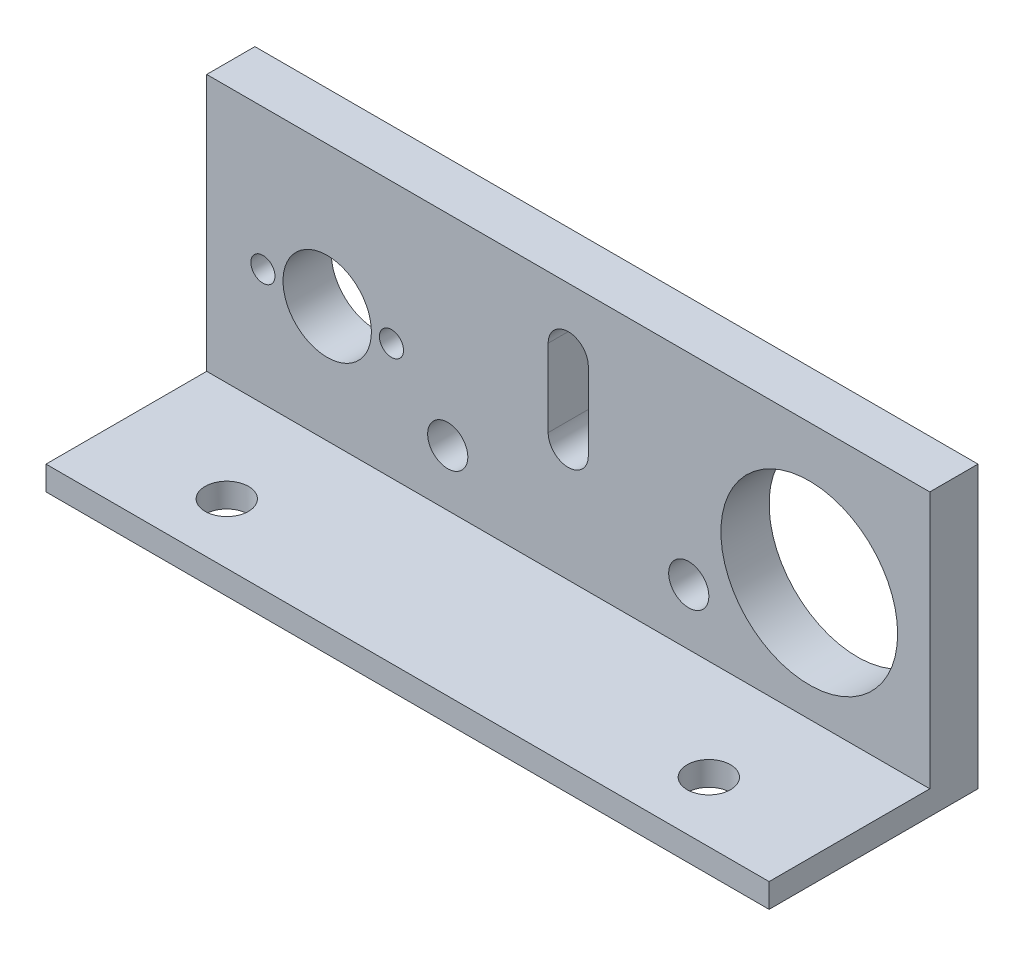
ISO-10303-21;
HEADER;
FILE_DESCRIPTION(('STEP AP214'),'2;1');
FILE_NAME('part.step','',(''),(''),'','','');
FILE_SCHEMA(('AUTOMOTIVE_DESIGN { 1 0 10303 214 1 1 1 1 }'));
ENDSEC;
DATA;
#1=APPLICATION_CONTEXT('core data for automotive mechanical design processes');
#2=APPLICATION_PROTOCOL_DEFINITION('international standard','automotive_design',2000,#1);
#3=PRODUCT_CONTEXT('',#1,'mechanical');
#4=PRODUCT('Part','Part','',(#3));
#5=PRODUCT_RELATED_PRODUCT_CATEGORY('part','',(#4));
#6=PRODUCT_DEFINITION_FORMATION('','',#4);
#7=PRODUCT_DEFINITION_CONTEXT('part definition',#1,'design');
#8=PRODUCT_DEFINITION('design','',#6,#7);
#9=PRODUCT_DEFINITION_SHAPE('','',#8);
#10=(LENGTH_UNIT() NAMED_UNIT(*) SI_UNIT(.MILLI.,.METRE.));
#11=(NAMED_UNIT(*) PLANE_ANGLE_UNIT() SI_UNIT($,.RADIAN.));
#12=(NAMED_UNIT(*) SI_UNIT($,.STERADIAN.) SOLID_ANGLE_UNIT());
#13=UNCERTAINTY_MEASURE_WITH_UNIT(LENGTH_MEASURE(1.E-05),#10,'distance_accuracy_value','');
#14=(GEOMETRIC_REPRESENTATION_CONTEXT(3) GLOBAL_UNCERTAINTY_ASSIGNED_CONTEXT((#13)) GLOBAL_UNIT_ASSIGNED_CONTEXT((#10,
#11,#12)) REPRESENTATION_CONTEXT('',''));
#15=CARTESIAN_POINT('',(0.,0.,0.));
#16=DIRECTION('',(0.,0.,1.));
#17=DIRECTION('',(1.,0.,0.));
#18=AXIS2_PLACEMENT_3D('',#15,#16,#17);
#19=CARTESIAN_POINT('',(0.,0.,6.));
#20=DIRECTION('',(0.,0.,-1.));
#21=DIRECTION('',(-1.,0.,0.));
#22=AXIS2_PLACEMENT_3D('',#19,#20,#21);
#23=PLANE('',#22);
#24=CARTESIAN_POINT('',(15.,-7.49999999999999,6.));
#25=DIRECTION('',(0.,0.,1.));
#26=DIRECTION('',(1.,0.,0.));
#27=AXIS2_PLACEMENT_3D('',#24,#25,#26);
#28=CIRCLE('',#27,2.49999999999999);
#29=CARTESIAN_POINT('',(17.5,-7.49999999999999,6.));
#30=VERTEX_POINT('',#29);
#31=EDGE_CURVE('E217',#30,#30,#28,.T.);
#32=ORIENTED_EDGE('',*,*,#31,.F.);
#33=EDGE_LOOP('',(#32));
#34=FACE_BOUND('',#33,.T.);
#35=CARTESIAN_POINT('',(-15.,-7.49999999999999,6.));
#36=DIRECTION('',(0.,0.,1.));
#37=DIRECTION('',(-1.,0.,0.));
#38=AXIS2_PLACEMENT_3D('',#35,#36,#37);
#39=CIRCLE('',#38,2.5);
#40=CARTESIAN_POINT('',(-17.5,-7.49999999999999,6.));
#41=VERTEX_POINT('',#40);
#42=EDGE_CURVE('E139',#41,#41,#39,.T.);
#43=ORIENTED_EDGE('',*,*,#42,.F.);
#44=EDGE_LOOP('',(#43));
#45=FACE_BOUND('',#44,.T.);
#46=DIRECTION('',(0.,-1.,0.));
#47=VECTOR('',#46,1.);
#48=CARTESIAN_POINT('',(-2.5,9.77898960764086,6.));
#49=LINE('',#48,#47);
#50=CARTESIAN_POINT('',(-2.5,9.77898960764086,6.));
#51=VERTEX_POINT('',#50);
#52=CARTESIAN_POINT('',(-2.49999999999999,0.141519694399124,6.));
#53=VERTEX_POINT('',#52);
#54=EDGE_CURVE('E126',#51,#53,#49,.T.);
#55=ORIENTED_EDGE('',*,*,#54,.F.);
#56=CARTESIAN_POINT('',(0.,9.77898960764086,6.));
#57=DIRECTION('',(0.,0.,1.));
#58=DIRECTION('',(1.,0.,0.));
#59=AXIS2_PLACEMENT_3D('',#56,#57,#58);
#60=CIRCLE('',#59,2.5);
#61=CARTESIAN_POINT('',(2.5,9.77898960764086,6.));
#62=VERTEX_POINT('',#61);
#63=EDGE_CURVE('E53',#62,#51,#60,.T.);
#64=ORIENTED_EDGE('',*,*,#63,.F.);
#65=DIRECTION('',(0.,1.,0.));
#66=VECTOR('',#65,1.);
#67=CARTESIAN_POINT('',(2.5,9.77898960764086,6.));
#68=LINE('',#67,#66);
#69=CARTESIAN_POINT('',(2.5,0.141519694399124,6.));
#70=VERTEX_POINT('',#69);
#71=EDGE_CURVE('E132',#70,#62,#68,.T.);
#72=ORIENTED_EDGE('',*,*,#71,.F.);
#73=CARTESIAN_POINT('',(0.,0.141519694399123,6.));
#74=DIRECTION('',(0.,0.,1.));
#75=DIRECTION('',(1.,0.,0.));
#76=AXIS2_PLACEMENT_3D('',#73,#74,#75);
#77=CIRCLE('',#76,2.5);
#78=EDGE_CURVE('E117',#53,#70,#77,.T.);
#79=ORIENTED_EDGE('',*,*,#78,.F.);
#80=EDGE_LOOP('',(#55,#64,#72,#79));
#81=FACE_BOUND('',#80,.T.);
#82=CARTESIAN_POINT('',(29.9996666657407,0.200000000000013,6.));
#83=DIRECTION('',(0.,0.,1.));
#84=DIRECTION('',(1.,0.,0.));
#85=AXIS2_PLACEMENT_3D('',#82,#83,#84);
#86=CIRCLE('',#85,11.);
#87=CARTESIAN_POINT('',(40.9996666657407,0.200000000000013,6.));
#88=VERTEX_POINT('',#87);
#89=EDGE_CURVE('E162',#88,#88,#86,.T.);
#90=ORIENTED_EDGE('',*,*,#89,.F.);
#91=EDGE_LOOP('',(#90));
#92=FACE_BOUND('',#91,.T.);
#93=CARTESIAN_POINT('',(-22.,0.,6.));
#94=DIRECTION('',(0.,0.,1.));
#95=DIRECTION('',(1.,0.,0.));
#96=AXIS2_PLACEMENT_3D('',#93,#94,#95);
#97=CIRCLE('',#96,1.5);
#98=CARTESIAN_POINT('',(-20.5,0.,6.));
#99=VERTEX_POINT('',#98);
#100=EDGE_CURVE('E168',#99,#99,#97,.T.);
#101=ORIENTED_EDGE('',*,*,#100,.F.);
#102=EDGE_LOOP('',(#101));
#103=FACE_BOUND('',#102,.T.);
#104=CARTESIAN_POINT('',(-38.,0.,6.));
#105=DIRECTION('',(0.,0.,1.));
#106=DIRECTION('',(1.,0.,0.));
#107=AXIS2_PLACEMENT_3D('',#104,#105,#106);
#108=CIRCLE('',#107,1.5);
#109=CARTESIAN_POINT('',(-36.5,0.,6.));
#110=VERTEX_POINT('',#109);
#111=EDGE_CURVE('E174',#110,#110,#108,.T.);
#112=ORIENTED_EDGE('',*,*,#111,.F.);
#113=EDGE_LOOP('',(#112));
#114=FACE_BOUND('',#113,.T.);
#115=CARTESIAN_POINT('',(-30.,0.,6.));
#116=DIRECTION('',(0.,0.,1.));
#117=DIRECTION('',(1.,0.,0.));
#118=AXIS2_PLACEMENT_3D('',#115,#116,#117);
#119=CIRCLE('',#118,5.5);
#120=CARTESIAN_POINT('',(-24.5,0.,6.));
#121=VERTEX_POINT('',#120);
#122=EDGE_CURVE('E180',#121,#121,#119,.T.);
#123=ORIENTED_EDGE('',*,*,#122,.F.);
#124=EDGE_LOOP('',(#123));
#125=FACE_BOUND('',#124,.T.);
#126=DIRECTION('',(-1.,0.,0.));
#127=VECTOR('',#126,1.);
#128=CARTESIAN_POINT('',(-45.,-14.5,6.));
#129=LINE('',#128,#127);
#130=CARTESIAN_POINT('',(45.,-14.5,6.));
#131=VERTEX_POINT('',#130);
#132=CARTESIAN_POINT('',(-45.,-14.5,6.));
#133=VERTEX_POINT('',#132);
#134=EDGE_CURVE('E146',#131,#133,#129,.T.);
#135=ORIENTED_EDGE('',*,*,#134,.F.);
#136=DIRECTION('',(0.,1.,0.));
#137=VECTOR('',#136,1.);
#138=CARTESIAN_POINT('',(45.,-17.5,6.));
#139=LINE('',#138,#137);
#140=CARTESIAN_POINT('',(45.,17.5,6.));
#141=VERTEX_POINT('',#140);
#142=EDGE_CURVE('E186',#131,#141,#139,.T.);
#143=ORIENTED_EDGE('',*,*,#142,.T.);
#144=DIRECTION('',(-1.,0.,0.));
#145=VECTOR('',#144,1.);
#146=CARTESIAN_POINT('',(-45.,17.5,6.));
#147=LINE('',#146,#145);
#148=CARTESIAN_POINT('',(-45.,17.5,6.));
#149=VERTEX_POINT('',#148);
#150=EDGE_CURVE('E188',#141,#149,#147,.T.);
#151=ORIENTED_EDGE('',*,*,#150,.T.);
#152=DIRECTION('',(0.,-1.,0.));
#153=VECTOR('',#152,1.);
#154=CARTESIAN_POINT('',(-45.,-17.5,6.));
#155=LINE('',#154,#153);
#156=EDGE_CURVE('E191',#149,#133,#155,.T.);
#157=ORIENTED_EDGE('',*,*,#156,.T.);
#158=EDGE_LOOP('',(#135,#143,#151,#157));
#159=FACE_BOUND('',#158,.T.);
#160=ADVANCED_FACE('F36',(#34,#45,#81,#92,#103,#114,#125,#159),#23,.F.);
#161=CARTESIAN_POINT('',(0.,0.,0.));
#162=DIRECTION('',(0.,0.,-1.));
#163=DIRECTION('',(-1.,0.,0.));
#164=AXIS2_PLACEMENT_3D('',#161,#162,#163);
#165=PLANE('',#164);
#166=CARTESIAN_POINT('',(15.,-7.49999999999999,0.));
#167=DIRECTION('',(0.,0.,-1.));
#168=DIRECTION('',(-1.,0.,0.));
#169=AXIS2_PLACEMENT_3D('',#166,#167,#168);
#170=CIRCLE('',#169,2.49999999999999);
#171=CARTESIAN_POINT('',(12.5,-7.49999999999999,0.));
#172=VERTEX_POINT('',#171);
#173=EDGE_CURVE('E40',#172,#172,#170,.T.);
#174=ORIENTED_EDGE('',*,*,#173,.F.);
#175=EDGE_LOOP('',(#174));
#176=FACE_BOUND('',#175,.T.);
#177=CARTESIAN_POINT('',(-15.,-7.49999999999999,0.));
#178=DIRECTION('',(0.,0.,-1.));
#179=DIRECTION('',(-1.,0.,0.));
#180=AXIS2_PLACEMENT_3D('',#177,#178,#179);
#181=CIRCLE('',#180,2.5);
#182=CARTESIAN_POINT('',(-17.5,-7.49999999999999,0.));
#183=VERTEX_POINT('',#182);
#184=EDGE_CURVE('E215',#183,#183,#181,.T.);
#185=ORIENTED_EDGE('',*,*,#184,.F.);
#186=EDGE_LOOP('',(#185));
#187=FACE_BOUND('',#186,.T.);
#188=CARTESIAN_POINT('',(0.,9.77898960764086,0.));
#189=DIRECTION('',(0.,0.,-1.));
#190=DIRECTION('',(-1.,0.,0.));
#191=AXIS2_PLACEMENT_3D('',#188,#189,#190);
#192=CIRCLE('',#191,2.5);
#193=CARTESIAN_POINT('',(-2.5,9.77898960764086,0.));
#194=VERTEX_POINT('',#193);
#195=CARTESIAN_POINT('',(2.5,9.77898960764086,0.));
#196=VERTEX_POINT('',#195);
#197=EDGE_CURVE('E11',#194,#196,#192,.T.);
#198=ORIENTED_EDGE('',*,*,#197,.F.);
#199=DIRECTION('',(0.,1.,0.));
#200=VECTOR('',#199,1.);
#201=CARTESIAN_POINT('',(-2.49999999999999,0.,0.));
#202=LINE('',#201,#200);
#203=CARTESIAN_POINT('',(-2.49999999999999,0.141519694399124,0.));
#204=VERTEX_POINT('',#203);
#205=EDGE_CURVE('E212',#204,#194,#202,.T.);
#206=ORIENTED_EDGE('',*,*,#205,.F.);
#207=CARTESIAN_POINT('',(0.,0.141519694399123,0.));
#208=DIRECTION('',(0.,0.,-1.));
#209=DIRECTION('',(-1.,0.,0.));
#210=AXIS2_PLACEMENT_3D('',#207,#208,#209);
#211=CIRCLE('',#210,2.5);
#212=CARTESIAN_POINT('',(2.5,0.141519694399124,0.));
#213=VERTEX_POINT('',#212);
#214=EDGE_CURVE('E120',#213,#204,#211,.T.);
#215=ORIENTED_EDGE('',*,*,#214,.F.);
#216=DIRECTION('',(0.,-1.,0.));
#217=VECTOR('',#216,1.);
#218=CARTESIAN_POINT('',(2.5,0.,0.));
#219=LINE('',#218,#217);
#220=EDGE_CURVE('E45',#196,#213,#219,.T.);
#221=ORIENTED_EDGE('',*,*,#220,.F.);
#222=EDGE_LOOP('',(#198,#206,#215,#221));
#223=FACE_BOUND('',#222,.T.);
#224=CARTESIAN_POINT('',(-22.,0.,0.));
#225=DIRECTION('',(0.,0.,1.));
#226=DIRECTION('',(1.,0.,0.));
#227=AXIS2_PLACEMENT_3D('',#224,#225,#226);
#228=CIRCLE('',#227,1.5);
#229=CARTESIAN_POINT('',(-20.5,0.,0.));
#230=VERTEX_POINT('',#229);
#231=EDGE_CURVE('E165',#230,#230,#228,.T.);
#232=ORIENTED_EDGE('',*,*,#231,.T.);
#233=EDGE_LOOP('',(#232));
#234=FACE_BOUND('',#233,.T.);
#235=CARTESIAN_POINT('',(-30.,0.,0.));
#236=DIRECTION('',(0.,0.,1.));
#237=DIRECTION('',(1.,0.,0.));
#238=AXIS2_PLACEMENT_3D('',#235,#236,#237);
#239=CIRCLE('',#238,5.5);
#240=CARTESIAN_POINT('',(-24.5,0.,0.));
#241=VERTEX_POINT('',#240);
#242=EDGE_CURVE('E177',#241,#241,#239,.T.);
#243=ORIENTED_EDGE('',*,*,#242,.T.);
#244=EDGE_LOOP('',(#243));
#245=FACE_BOUND('',#244,.T.);
#246=DIRECTION('',(0.,1.,0.));
#247=VECTOR('',#246,1.);
#248=CARTESIAN_POINT('',(45.,-17.5,0.));
#249=LINE('',#248,#247);
#250=CARTESIAN_POINT('',(45.,-17.5,0.));
#251=VERTEX_POINT('',#250);
#252=CARTESIAN_POINT('',(45.,17.5,0.));
#253=VERTEX_POINT('',#252);
#254=EDGE_CURVE('E183',#251,#253,#249,.T.);
#255=ORIENTED_EDGE('',*,*,#254,.F.);
#256=DIRECTION('',(1.,0.,0.));
#257=VECTOR('',#256,1.);
#258=CARTESIAN_POINT('',(-45.,-17.5,0.));
#259=LINE('',#258,#257);
#260=CARTESIAN_POINT('',(-45.,-17.5,0.));
#261=VERTEX_POINT('',#260);
#262=EDGE_CURVE('E189',#261,#251,#259,.T.);
#263=ORIENTED_EDGE('',*,*,#262,.F.);
#264=DIRECTION('',(0.,-1.,0.));
#265=VECTOR('',#264,1.);
#266=CARTESIAN_POINT('',(-45.,-17.5,0.));
#267=LINE('',#266,#265);
#268=CARTESIAN_POINT('',(-45.,17.5,0.));
#269=VERTEX_POINT('',#268);
#270=EDGE_CURVE('E198',#269,#261,#267,.T.);
#271=ORIENTED_EDGE('',*,*,#270,.F.);
#272=DIRECTION('',(-1.,0.,0.));
#273=VECTOR('',#272,1.);
#274=CARTESIAN_POINT('',(-45.,17.5,0.));
#275=LINE('',#274,#273);
#276=EDGE_CURVE('E196',#253,#269,#275,.T.);
#277=ORIENTED_EDGE('',*,*,#276,.F.);
#278=EDGE_LOOP('',(#255,#263,#271,#277));
#279=FACE_BOUND('',#278,.T.);
#280=CARTESIAN_POINT('',(-38.,0.,0.));
#281=DIRECTION('',(0.,0.,1.));
#282=DIRECTION('',(1.,0.,0.));
#283=AXIS2_PLACEMENT_3D('',#280,#281,#282);
#284=CIRCLE('',#283,1.5);
#285=CARTESIAN_POINT('',(-36.5,0.,0.));
#286=VERTEX_POINT('',#285);
#287=EDGE_CURVE('E171',#286,#286,#284,.T.);
#288=ORIENTED_EDGE('',*,*,#287,.T.);
#289=EDGE_LOOP('',(#288));
#290=FACE_BOUND('',#289,.T.);
#291=CARTESIAN_POINT('',(29.9996666657407,0.200000000000013,0.));
#292=DIRECTION('',(0.,0.,1.));
#293=DIRECTION('',(1.,0.,0.));
#294=AXIS2_PLACEMENT_3D('',#291,#292,#293);
#295=CIRCLE('',#294,11.);
#296=CARTESIAN_POINT('',(40.9996666657407,0.200000000000013,0.));
#297=VERTEX_POINT('',#296);
#298=EDGE_CURVE('E161',#297,#297,#295,.T.);
#299=ORIENTED_EDGE('',*,*,#298,.T.);
#300=EDGE_LOOP('',(#299));
#301=FACE_BOUND('',#300,.T.);
#302=ADVANCED_FACE('F277',(#176,#187,#223,#234,#245,#279,#290,#301),#165,.T.);
#303=CARTESIAN_POINT('',(45.,-17.5,6.));
#304=DIRECTION('',(-1.,0.,0.));
#305=DIRECTION('',(0.,0.,1.));
#306=AXIS2_PLACEMENT_3D('',#303,#304,#305);
#307=PLANE('',#306);
#308=ORIENTED_EDGE('',*,*,#254,.T.);
#309=DIRECTION('',(0.,0.,-1.));
#310=VECTOR('',#309,1.);
#311=CARTESIAN_POINT('',(45.,17.5,6.));
#312=LINE('',#311,#310);
#313=EDGE_CURVE('E209',#141,#253,#312,.T.);
#314=ORIENTED_EDGE('',*,*,#313,.F.);
#315=ORIENTED_EDGE('',*,*,#142,.F.);
#316=DIRECTION('',(0.,0.,-1.));
#317=VECTOR('',#316,1.);
#318=CARTESIAN_POINT('',(45.,-14.5,26.));
#319=LINE('',#318,#317);
#320=CARTESIAN_POINT('',(45.,-14.5,26.));
#321=VERTEX_POINT('',#320);
#322=EDGE_CURVE('E158',#321,#131,#319,.T.);
#323=ORIENTED_EDGE('',*,*,#322,.F.);
#324=DIRECTION('',(0.,1.,0.));
#325=VECTOR('',#324,1.);
#326=CARTESIAN_POINT('',(45.,-17.5,26.));
#327=LINE('',#326,#325);
#328=CARTESIAN_POINT('',(45.,-17.5,26.));
#329=VERTEX_POINT('',#328);
#330=EDGE_CURVE('E149',#329,#321,#327,.T.);
#331=ORIENTED_EDGE('',*,*,#330,.F.);
#332=DIRECTION('',(0.,0.,-1.));
#333=VECTOR('',#332,1.);
#334=CARTESIAN_POINT('',(45.,-17.5,6.));
#335=LINE('',#334,#333);
#336=EDGE_CURVE('E193',#329,#251,#335,.T.);
#337=ORIENTED_EDGE('',*,*,#336,.T.);
#338=EDGE_LOOP('',(#308,#314,#315,#323,#331,#337));
#339=FACE_BOUND('',#338,.T.);
#340=ADVANCED_FACE('F38',(#339),#307,.F.);
#341=CARTESIAN_POINT('',(-45.,17.5,6.));
#342=DIRECTION('',(0.,-1.,0.));
#343=DIRECTION('',(0.,0.,-1.));
#344=AXIS2_PLACEMENT_3D('',#341,#342,#343);
#345=PLANE('',#344);
#346=ORIENTED_EDGE('',*,*,#276,.T.);
#347=DIRECTION('',(0.,0.,-1.));
#348=VECTOR('',#347,1.);
#349=CARTESIAN_POINT('',(-45.,17.5,6.));
#350=LINE('',#349,#348);
#351=EDGE_CURVE('E206',#149,#269,#350,.T.);
#352=ORIENTED_EDGE('',*,*,#351,.F.);
#353=ORIENTED_EDGE('',*,*,#150,.F.);
#354=ORIENTED_EDGE('',*,*,#313,.T.);
#355=EDGE_LOOP('',(#346,#352,#353,#354));
#356=FACE_BOUND('',#355,.T.);
#357=ADVANCED_FACE('F272',(#356),#345,.F.);
#358=CARTESIAN_POINT('',(-45.,-17.5,6.));
#359=DIRECTION('',(1.,0.,0.));
#360=DIRECTION('',(0.,0.,-1.));
#361=AXIS2_PLACEMENT_3D('',#358,#359,#360);
#362=PLANE('',#361);
#363=ORIENTED_EDGE('',*,*,#270,.T.);
#364=DIRECTION('',(0.,0.,-1.));
#365=VECTOR('',#364,1.);
#366=CARTESIAN_POINT('',(-45.,-17.5,6.));
#367=LINE('',#366,#365);
#368=CARTESIAN_POINT('',(-45.,-17.5,26.));
#369=VERTEX_POINT('',#368);
#370=EDGE_CURVE('E203',#369,#261,#367,.T.);
#371=ORIENTED_EDGE('',*,*,#370,.F.);
#372=DIRECTION('',(0.,-1.,0.));
#373=VECTOR('',#372,1.);
#374=CARTESIAN_POINT('',(-45.,-17.5,26.));
#375=LINE('',#374,#373);
#376=CARTESIAN_POINT('',(-45.,-14.5,26.));
#377=VERTEX_POINT('',#376);
#378=EDGE_CURVE('E142',#377,#369,#375,.T.);
#379=ORIENTED_EDGE('',*,*,#378,.F.);
#380=DIRECTION('',(0.,0.,-1.));
#381=VECTOR('',#380,1.);
#382=CARTESIAN_POINT('',(-45.,-14.5,26.));
#383=LINE('',#382,#381);
#384=EDGE_CURVE('E153',#377,#133,#383,.T.);
#385=ORIENTED_EDGE('',*,*,#384,.T.);
#386=ORIENTED_EDGE('',*,*,#156,.F.);
#387=ORIENTED_EDGE('',*,*,#351,.T.);
#388=EDGE_LOOP('',(#363,#371,#379,#385,#386,#387));
#389=FACE_BOUND('',#388,.T.);
#390=ADVANCED_FACE('F263',(#389),#362,.F.);
#391=CARTESIAN_POINT('',(-45.,-17.5,6.));
#392=DIRECTION('',(0.,1.,0.));
#393=DIRECTION('',(0.,0.,1.));
#394=AXIS2_PLACEMENT_3D('',#391,#392,#393);
#395=PLANE('',#394);
#396=CARTESIAN_POINT('',(30.,-17.5,18.5));
#397=DIRECTION('',(0.,1.,0.));
#398=DIRECTION('',(0.,0.,1.));
#399=AXIS2_PLACEMENT_3D('',#396,#397,#398);
#400=CIRCLE('',#399,2.7);
#401=CARTESIAN_POINT('',(30.,-17.5,21.2));
#402=VERTEX_POINT('',#401);
#403=EDGE_CURVE('E228',#402,#402,#400,.T.);
#404=ORIENTED_EDGE('',*,*,#403,.T.);
#405=EDGE_LOOP('',(#404));
#406=FACE_BOUND('',#405,.T.);
#407=CARTESIAN_POINT('',(-30.,-17.5,18.5));
#408=DIRECTION('',(0.,1.,0.));
#409=DIRECTION('',(0.,0.,1.));
#410=AXIS2_PLACEMENT_3D('',#407,#408,#409);
#411=CIRCLE('',#410,2.7);
#412=CARTESIAN_POINT('',(-30.,-17.5,21.2));
#413=VERTEX_POINT('',#412);
#414=EDGE_CURVE('E231',#413,#413,#411,.T.);
#415=ORIENTED_EDGE('',*,*,#414,.T.);
#416=EDGE_LOOP('',(#415));
#417=FACE_BOUND('',#416,.T.);
#418=ORIENTED_EDGE('',*,*,#262,.T.);
#419=ORIENTED_EDGE('',*,*,#336,.F.);
#420=DIRECTION('',(1.,0.,0.));
#421=VECTOR('',#420,1.);
#422=CARTESIAN_POINT('',(-45.,-17.5,26.));
#423=LINE('',#422,#421);
#424=EDGE_CURVE('E145',#369,#329,#423,.T.);
#425=ORIENTED_EDGE('',*,*,#424,.F.);
#426=ORIENTED_EDGE('',*,*,#370,.T.);
#427=EDGE_LOOP('',(#418,#419,#425,#426));
#428=FACE_BOUND('',#427,.T.);
#429=ADVANCED_FACE('F280',(#406,#417,#428),#395,.F.);
#430=CARTESIAN_POINT('',(-30.,0.,6.));
#431=DIRECTION('',(0.,0.,-1.));
#432=DIRECTION('',(-1.,0.,0.));
#433=AXIS2_PLACEMENT_3D('',#430,#431,#432);
#434=CYLINDRICAL_SURFACE('',#433,5.5);
#435=ORIENTED_EDGE('',*,*,#122,.T.);
#436=EDGE_LOOP('',(#435));
#437=FACE_BOUND('',#436,.T.);
#438=ORIENTED_EDGE('',*,*,#242,.F.);
#439=EDGE_LOOP('',(#438));
#440=FACE_BOUND('',#439,.T.);
#441=ADVANCED_FACE('F282',(#437,#440),#434,.F.);
#442=CARTESIAN_POINT('',(-38.,0.,6.));
#443=DIRECTION('',(0.,0.,-1.));
#444=DIRECTION('',(-1.,0.,0.));
#445=AXIS2_PLACEMENT_3D('',#442,#443,#444);
#446=CYLINDRICAL_SURFACE('',#445,1.5);
#447=ORIENTED_EDGE('',*,*,#111,.T.);
#448=EDGE_LOOP('',(#447));
#449=FACE_BOUND('',#448,.T.);
#450=ORIENTED_EDGE('',*,*,#287,.F.);
#451=EDGE_LOOP('',(#450));
#452=FACE_BOUND('',#451,.T.);
#453=ADVANCED_FACE('F288',(#449,#452),#446,.F.);
#454=CARTESIAN_POINT('',(-22.,0.,6.));
#455=DIRECTION('',(0.,0.,-1.));
#456=DIRECTION('',(-1.,0.,0.));
#457=AXIS2_PLACEMENT_3D('',#454,#455,#456);
#458=CYLINDRICAL_SURFACE('',#457,1.5);
#459=ORIENTED_EDGE('',*,*,#100,.T.);
#460=EDGE_LOOP('',(#459));
#461=FACE_BOUND('',#460,.T.);
#462=ORIENTED_EDGE('',*,*,#231,.F.);
#463=EDGE_LOOP('',(#462));
#464=FACE_BOUND('',#463,.T.);
#465=ADVANCED_FACE('F304',(#461,#464),#458,.F.);
#466=CARTESIAN_POINT('',(29.9996666657407,0.200000000000013,6.));
#467=DIRECTION('',(0.,0.,-1.));
#468=DIRECTION('',(-1.,0.,0.));
#469=AXIS2_PLACEMENT_3D('',#466,#467,#468);
#470=CYLINDRICAL_SURFACE('',#469,11.);
#471=ORIENTED_EDGE('',*,*,#89,.T.);
#472=EDGE_LOOP('',(#471));
#473=FACE_BOUND('',#472,.T.);
#474=ORIENTED_EDGE('',*,*,#298,.F.);
#475=EDGE_LOOP('',(#474));
#476=FACE_BOUND('',#475,.T.);
#477=ADVANCED_FACE('F252',(#473,#476),#470,.F.);
#478=CARTESIAN_POINT('',(-45.,-14.5,26.));
#479=DIRECTION('',(0.,-1.,0.));
#480=DIRECTION('',(0.,0.,-1.));
#481=AXIS2_PLACEMENT_3D('',#478,#479,#480);
#482=PLANE('',#481);
#483=CARTESIAN_POINT('',(30.,-14.5,18.5));
#484=DIRECTION('',(0.,1.,0.));
#485=DIRECTION('',(0.,0.,1.));
#486=AXIS2_PLACEMENT_3D('',#483,#484,#485);
#487=CIRCLE('',#486,2.7);
#488=CARTESIAN_POINT('',(30.,-14.5,21.2));
#489=VERTEX_POINT('',#488);
#490=EDGE_CURVE('E235',#489,#489,#487,.T.);
#491=ORIENTED_EDGE('',*,*,#490,.F.);
#492=EDGE_LOOP('',(#491));
#493=FACE_BOUND('',#492,.T.);
#494=CARTESIAN_POINT('',(-30.,-14.5,18.5));
#495=DIRECTION('',(0.,1.,0.));
#496=DIRECTION('',(0.,0.,-1.));
#497=AXIS2_PLACEMENT_3D('',#494,#495,#496);
#498=CIRCLE('',#497,2.7);
#499=CARTESIAN_POINT('',(-30.,-14.5,15.8));
#500=VERTEX_POINT('',#499);
#501=EDGE_CURVE('E239',#500,#500,#498,.T.);
#502=ORIENTED_EDGE('',*,*,#501,.F.);
#503=EDGE_LOOP('',(#502));
#504=FACE_BOUND('',#503,.T.);
#505=ORIENTED_EDGE('',*,*,#134,.T.);
#506=ORIENTED_EDGE('',*,*,#384,.F.);
#507=DIRECTION('',(-1.,0.,0.));
#508=VECTOR('',#507,1.);
#509=CARTESIAN_POINT('',(-45.,-14.5,26.));
#510=LINE('',#509,#508);
#511=EDGE_CURVE('E151',#321,#377,#510,.T.);
#512=ORIENTED_EDGE('',*,*,#511,.F.);
#513=ORIENTED_EDGE('',*,*,#322,.T.);
#514=EDGE_LOOP('',(#505,#506,#512,#513));
#515=FACE_BOUND('',#514,.T.);
#516=ADVANCED_FACE('F248',(#493,#504,#515),#482,.F.);
#517=CARTESIAN_POINT('',(0.,0.,26.));
#518=DIRECTION('',(0.,0.,-1.));
#519=DIRECTION('',(-1.,0.,0.));
#520=AXIS2_PLACEMENT_3D('',#517,#518,#519);
#521=PLANE('',#520);
#522=ORIENTED_EDGE('',*,*,#378,.T.);
#523=ORIENTED_EDGE('',*,*,#424,.T.);
#524=ORIENTED_EDGE('',*,*,#330,.T.);
#525=ORIENTED_EDGE('',*,*,#511,.T.);
#526=EDGE_LOOP('',(#522,#523,#524,#525));
#527=FACE_BOUND('',#526,.T.);
#528=ADVANCED_FACE('F251',(#527),#521,.F.);
#529=CARTESIAN_POINT('',(0.,9.77898960764086,-4.));
#530=DIRECTION('',(0.,0.,1.));
#531=DIRECTION('',(1.,0.,0.));
#532=AXIS2_PLACEMENT_3D('',#529,#530,#531);
#533=CYLINDRICAL_SURFACE('',#532,2.5);
#534=ORIENTED_EDGE('',*,*,#197,.T.);
#535=DIRECTION('',(0.,0.,1.));
#536=VECTOR('',#535,1.);
#537=CARTESIAN_POINT('',(2.5,9.77898960764086,-4.));
#538=LINE('',#537,#536);
#539=EDGE_CURVE('E137',#196,#62,#538,.T.);
#540=ORIENTED_EDGE('',*,*,#539,.T.);
#541=ORIENTED_EDGE('',*,*,#63,.T.);
#542=DIRECTION('',(0.,0.,1.));
#543=VECTOR('',#542,1.);
#544=CARTESIAN_POINT('',(-2.5,9.77898960764086,-4.));
#545=LINE('',#544,#543);
#546=EDGE_CURVE('E123',#194,#51,#545,.T.);
#547=ORIENTED_EDGE('',*,*,#546,.F.);
#548=EDGE_LOOP('',(#534,#540,#541,#547));
#549=FACE_BOUND('',#548,.T.);
#550=ADVANCED_FACE('F314',(#549),#533,.F.);
#551=CARTESIAN_POINT('',(2.5,9.77898960764086,-4.));
#552=DIRECTION('',(1.,0.,0.));
#553=DIRECTION('',(0.,1.,0.));
#554=AXIS2_PLACEMENT_3D('',#551,#552,#553);
#555=PLANE('',#554);
#556=ORIENTED_EDGE('',*,*,#220,.T.);
#557=DIRECTION('',(0.,0.,1.));
#558=VECTOR('',#557,1.);
#559=CARTESIAN_POINT('',(2.5,0.141519694399124,-4.));
#560=LINE('',#559,#558);
#561=EDGE_CURVE('E122',#213,#70,#560,.T.);
#562=ORIENTED_EDGE('',*,*,#561,.T.);
#563=ORIENTED_EDGE('',*,*,#71,.T.);
#564=ORIENTED_EDGE('',*,*,#539,.F.);
#565=EDGE_LOOP('',(#556,#562,#563,#564));
#566=FACE_BOUND('',#565,.T.);
#567=ADVANCED_FACE('F317',(#566),#555,.F.);
#568=CARTESIAN_POINT('',(0.,0.141519694399123,-4.));
#569=DIRECTION('',(0.,0.,1.));
#570=DIRECTION('',(1.,0.,0.));
#571=AXIS2_PLACEMENT_3D('',#568,#569,#570);
#572=CYLINDRICAL_SURFACE('',#571,2.5);
#573=ORIENTED_EDGE('',*,*,#214,.T.);
#574=DIRECTION('',(0.,0.,1.));
#575=VECTOR('',#574,1.);
#576=CARTESIAN_POINT('',(-2.49999999999999,0.141519694399124,-4.));
#577=LINE('',#576,#575);
#578=EDGE_CURVE('E61',#204,#53,#577,.T.);
#579=ORIENTED_EDGE('',*,*,#578,.T.);
#580=ORIENTED_EDGE('',*,*,#78,.T.);
#581=ORIENTED_EDGE('',*,*,#561,.F.);
#582=EDGE_LOOP('',(#573,#579,#580,#581));
#583=FACE_BOUND('',#582,.T.);
#584=ADVANCED_FACE('F114',(#583),#572,.F.);
#585=CARTESIAN_POINT('',(-2.5,9.77898960764086,-4.));
#586=DIRECTION('',(-1.,0.,0.));
#587=DIRECTION('',(0.,-1.,0.));
#588=AXIS2_PLACEMENT_3D('',#585,#586,#587);
#589=PLANE('',#588);
#590=ORIENTED_EDGE('',*,*,#205,.T.);
#591=ORIENTED_EDGE('',*,*,#546,.T.);
#592=ORIENTED_EDGE('',*,*,#54,.T.);
#593=ORIENTED_EDGE('',*,*,#578,.F.);
#594=EDGE_LOOP('',(#590,#591,#592,#593));
#595=FACE_BOUND('',#594,.T.);
#596=ADVANCED_FACE('F127',(#595),#589,.F.);
#597=CARTESIAN_POINT('',(-15.,-7.49999999999999,-4.));
#598=DIRECTION('',(0.,0.,1.));
#599=DIRECTION('',(1.,0.,0.));
#600=AXIS2_PLACEMENT_3D('',#597,#598,#599);
#601=CYLINDRICAL_SURFACE('',#600,2.5);
#602=ORIENTED_EDGE('',*,*,#184,.T.);
#603=EDGE_LOOP('',(#602));
#604=FACE_BOUND('',#603,.T.);
#605=ORIENTED_EDGE('',*,*,#42,.T.);
#606=EDGE_LOOP('',(#605));
#607=FACE_BOUND('',#606,.T.);
#608=ADVANCED_FACE('F320',(#604,#607),#601,.F.);
#609=CARTESIAN_POINT('',(15.,-7.49999999999999,-4.));
#610=DIRECTION('',(0.,0.,1.));
#611=DIRECTION('',(1.,0.,0.));
#612=AXIS2_PLACEMENT_3D('',#609,#610,#611);
#613=CYLINDRICAL_SURFACE('',#612,2.49999999999999);
#614=ORIENTED_EDGE('',*,*,#173,.T.);
#615=EDGE_LOOP('',(#614));
#616=FACE_BOUND('',#615,.T.);
#617=ORIENTED_EDGE('',*,*,#31,.T.);
#618=EDGE_LOOP('',(#617));
#619=FACE_BOUND('',#618,.T.);
#620=ADVANCED_FACE('F328',(#616,#619),#613,.F.);
#621=CARTESIAN_POINT('',(-30.,-24.5,18.5));
#622=DIRECTION('',(0.,1.,0.));
#623=DIRECTION('',(0.,0.,1.));
#624=AXIS2_PLACEMENT_3D('',#621,#622,#623);
#625=CYLINDRICAL_SURFACE('',#624,2.7);
#626=ORIENTED_EDGE('',*,*,#501,.T.);
#627=EDGE_LOOP('',(#626));
#628=FACE_BOUND('',#627,.T.);
#629=ORIENTED_EDGE('',*,*,#414,.F.);
#630=EDGE_LOOP('',(#629));
#631=FACE_BOUND('',#630,.T.);
#632=ADVANCED_FACE('F245',(#628,#631),#625,.F.);
#633=CARTESIAN_POINT('',(30.,-24.5,18.5));
#634=DIRECTION('',(0.,1.,0.));
#635=DIRECTION('',(0.,0.,1.));
#636=AXIS2_PLACEMENT_3D('',#633,#634,#635);
#637=CYLINDRICAL_SURFACE('',#636,2.7);
#638=ORIENTED_EDGE('',*,*,#490,.T.);
#639=EDGE_LOOP('',(#638));
#640=FACE_BOUND('',#639,.T.);
#641=ORIENTED_EDGE('',*,*,#403,.F.);
#642=EDGE_LOOP('',(#641));
#643=FACE_BOUND('',#642,.T.);
#644=ADVANCED_FACE('F334',(#640,#643),#637,.F.);
#645=CLOSED_SHELL('',(#160,#302,#340,#357,#390,#429,#441,#453,#465,#477,#516,#528,#550,#567,
#584,#596,#608,#620,#632,#644));
#646=MANIFOLD_SOLID_BREP('B2',#645);
#647=ADVANCED_BREP_SHAPE_REPRESENTATION('',(#18,#646),#14);
#648=SHAPE_DEFINITION_REPRESENTATION(#9,#647);
ENDSEC;
END-ISO-10303-21;
